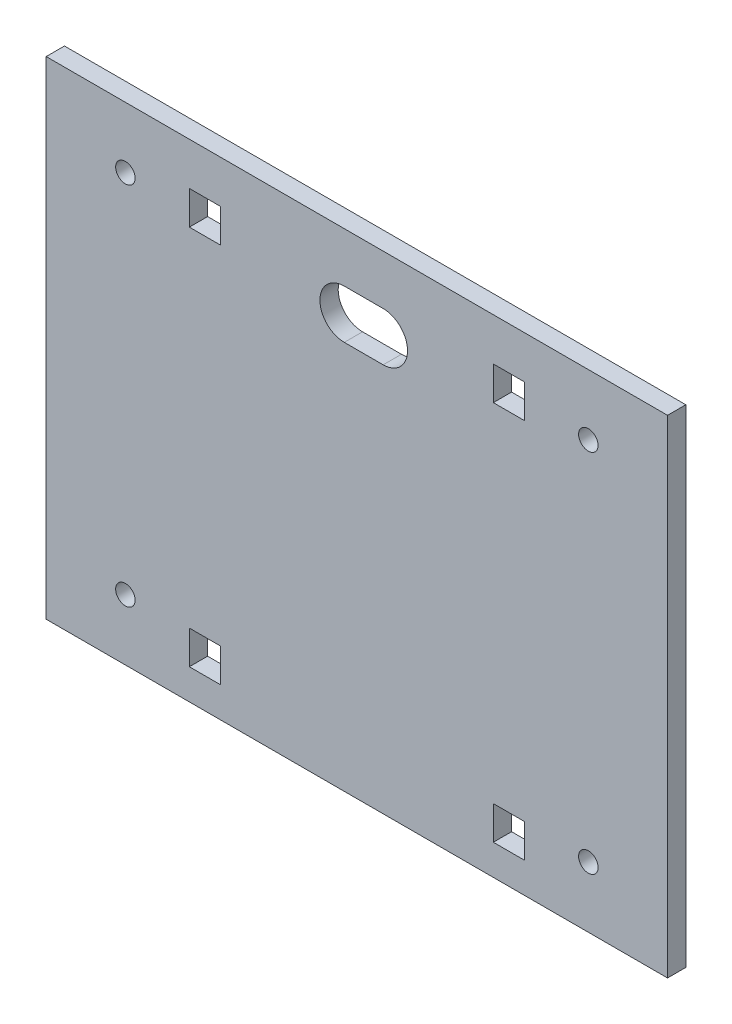
ISO-10303-21;
HEADER;
FILE_DESCRIPTION(('STEP AP214'),'2;1');
FILE_NAME('part.step','',(''),(''),'','','');
FILE_SCHEMA(('AUTOMOTIVE_DESIGN { 1 0 10303 214 1 1 1 1 }'));
ENDSEC;
DATA;
#1=APPLICATION_CONTEXT('core data for automotive mechanical design processes');
#2=APPLICATION_PROTOCOL_DEFINITION('international standard','automotive_design',2000,#1);
#3=PRODUCT_CONTEXT('',#1,'mechanical');
#4=PRODUCT('Part','Part','',(#3));
#5=PRODUCT_RELATED_PRODUCT_CATEGORY('part','',(#4));
#6=PRODUCT_DEFINITION_FORMATION('','',#4);
#7=PRODUCT_DEFINITION_CONTEXT('part definition',#1,'design');
#8=PRODUCT_DEFINITION('design','',#6,#7);
#9=PRODUCT_DEFINITION_SHAPE('','',#8);
#10=(LENGTH_UNIT() NAMED_UNIT(*) SI_UNIT(.MILLI.,.METRE.));
#11=(NAMED_UNIT(*) PLANE_ANGLE_UNIT() SI_UNIT($,.RADIAN.));
#12=(NAMED_UNIT(*) SI_UNIT($,.STERADIAN.) SOLID_ANGLE_UNIT());
#13=UNCERTAINTY_MEASURE_WITH_UNIT(LENGTH_MEASURE(1.E-05),#10,'distance_accuracy_value','');
#14=(GEOMETRIC_REPRESENTATION_CONTEXT(3) GLOBAL_UNCERTAINTY_ASSIGNED_CONTEXT((#13)) GLOBAL_UNIT_ASSIGNED_CONTEXT((#10,
#11,#12)) REPRESENTATION_CONTEXT('',''));
#15=CARTESIAN_POINT('',(0.,0.,0.));
#16=DIRECTION('',(0.,0.,1.));
#17=DIRECTION('',(1.,0.,0.));
#18=AXIS2_PLACEMENT_3D('',#15,#16,#17);
#19=CARTESIAN_POINT('',(0.,0.,3.));
#20=DIRECTION('',(0.,0.,-1.));
#21=DIRECTION('',(-1.,0.,0.));
#22=AXIS2_PLACEMENT_3D('',#19,#20,#21);
#23=PLANE('',#22);
#24=DIRECTION('',(0.,-1.,0.));
#25=VECTOR('',#24,1.);
#26=CARTESIAN_POINT('',(27.500000000002,-94.7499999999985,3.));
#27=LINE('',#26,#25);
#28=CARTESIAN_POINT('',(27.500000000002,-94.7499999999985,3.));
#29=VERTEX_POINT('',#28);
#30=CARTESIAN_POINT('',(27.500000000002,-100.249999999999,3.));
#31=VERTEX_POINT('',#30);
#32=EDGE_CURVE('E236',#29,#31,#27,.T.);
#33=ORIENTED_EDGE('',*,*,#32,.T.);
#34=DIRECTION('',(-1.,0.,0.));
#35=VECTOR('',#34,1.);
#36=CARTESIAN_POINT('',(27.500000000002,-100.249999999999,3.));
#37=LINE('',#36,#35);
#38=CARTESIAN_POINT('',(22.400000000002,-100.249999999999,3.));
#39=VERTEX_POINT('',#38);
#40=EDGE_CURVE('E251',#31,#39,#37,.T.);
#41=ORIENTED_EDGE('',*,*,#40,.T.);
#42=DIRECTION('',(0.,1.,0.));
#43=VECTOR('',#42,1.);
#44=CARTESIAN_POINT('',(22.400000000002,-94.7499999999985,3.));
#45=LINE('',#44,#43);
#46=CARTESIAN_POINT('',(22.400000000002,-94.7499999999985,3.));
#47=VERTEX_POINT('',#46);
#48=EDGE_CURVE('E248',#39,#47,#45,.T.);
#49=ORIENTED_EDGE('',*,*,#48,.T.);
#50=DIRECTION('',(1.,0.,0.));
#51=VECTOR('',#50,1.);
#52=CARTESIAN_POINT('',(27.500000000002,-94.7499999999985,3.));
#53=LINE('',#52,#51);
#54=EDGE_CURVE('E245',#47,#29,#53,.T.);
#55=ORIENTED_EDGE('',*,*,#54,.T.);
#56=EDGE_LOOP('',(#33,#41,#49,#55));
#57=FACE_BOUND('',#56,.T.);
#58=DIRECTION('',(1.,0.,0.));
#59=VECTOR('',#58,1.);
#60=CARTESIAN_POINT('',(-27.500000000002,-100.249999999999,3.));
#61=LINE('',#60,#59);
#62=CARTESIAN_POINT('',(-27.500000000002,-100.249999999999,3.));
#63=VERTEX_POINT('',#62);
#64=CARTESIAN_POINT('',(-22.400000000002,-100.249999999999,3.));
#65=VERTEX_POINT('',#64);
#66=EDGE_CURVE('E265',#63,#65,#61,.T.);
#67=ORIENTED_EDGE('',*,*,#66,.F.);
#68=DIRECTION('',(0.,-1.,0.));
#69=VECTOR('',#68,1.);
#70=CARTESIAN_POINT('',(-27.500000000002,-94.7499999999985,3.));
#71=LINE('',#70,#69);
#72=CARTESIAN_POINT('',(-27.500000000002,-94.7499999999985,3.));
#73=VERTEX_POINT('',#72);
#74=EDGE_CURVE('E257',#73,#63,#71,.T.);
#75=ORIENTED_EDGE('',*,*,#74,.F.);
#76=DIRECTION('',(-1.,0.,0.));
#77=VECTOR('',#76,1.);
#78=CARTESIAN_POINT('',(-27.500000000002,-94.7499999999985,3.));
#79=LINE('',#78,#77);
#80=CARTESIAN_POINT('',(-22.400000000002,-94.7499999999985,3.));
#81=VERTEX_POINT('',#80);
#82=EDGE_CURVE('E271',#81,#73,#79,.T.);
#83=ORIENTED_EDGE('',*,*,#82,.F.);
#84=DIRECTION('',(0.,1.,0.));
#85=VECTOR('',#84,1.);
#86=CARTESIAN_POINT('',(-22.400000000002,-94.7499999999985,3.));
#87=LINE('',#86,#85);
#88=EDGE_CURVE('E268',#65,#81,#87,.T.);
#89=ORIENTED_EDGE('',*,*,#88,.F.);
#90=EDGE_LOOP('',(#67,#75,#83,#89));
#91=FACE_BOUND('',#90,.T.);
#92=DIRECTION('',(1.,0.,0.));
#93=VECTOR('',#92,1.);
#94=CARTESIAN_POINT('',(-2.06554207472256,-41.4151948880287,3.));
#95=LINE('',#94,#93);
#96=CARTESIAN_POINT('',(-2.06554207472256,-41.4151948880287,3.));
#97=VERTEX_POINT('',#96);
#98=CARTESIAN_POINT('',(4.31837847580327,-41.4151948880287,3.));
#99=VERTEX_POINT('',#98);
#100=EDGE_CURVE('E299',#97,#99,#95,.T.);
#101=ORIENTED_EDGE('',*,*,#100,.F.);
#102=CARTESIAN_POINT('',(-2.06554207472263,-37.4151948880287,3.));
#103=DIRECTION('',(0.,0.,1.));
#104=DIRECTION('',(1.,0.,0.));
#105=AXIS2_PLACEMENT_3D('',#102,#103,#104);
#106=CIRCLE('',#105,4.);
#107=CARTESIAN_POINT('',(-2.06554207472256,-33.4151948880287,3.));
#108=VERTEX_POINT('',#107);
#109=EDGE_CURVE('E277',#108,#97,#106,.T.);
#110=ORIENTED_EDGE('',*,*,#109,.F.);
#111=DIRECTION('',(-1.,0.,0.));
#112=VECTOR('',#111,1.);
#113=CARTESIAN_POINT('',(-2.06554207472256,-33.4151948880287,3.));
#114=LINE('',#113,#112);
#115=CARTESIAN_POINT('',(4.31837847580327,-33.4151948880287,3.));
#116=VERTEX_POINT('',#115);
#117=EDGE_CURVE('E288',#116,#108,#114,.T.);
#118=ORIENTED_EDGE('',*,*,#117,.F.);
#119=CARTESIAN_POINT('',(4.3183784758032,-37.4151948880287,3.));
#120=DIRECTION('',(0.,0.,1.));
#121=DIRECTION('',(1.,0.,0.));
#122=AXIS2_PLACEMENT_3D('',#119,#120,#121);
#123=CIRCLE('',#122,4.);
#124=EDGE_CURVE('E302',#99,#116,#123,.T.);
#125=ORIENTED_EDGE('',*,*,#124,.F.);
#126=EDGE_LOOP('',(#101,#110,#118,#125));
#127=FACE_BOUND('',#126,.T.);
#128=DIRECTION('',(0.,1.,0.));
#129=VECTOR('',#128,1.);
#130=CARTESIAN_POINT('',(50.9999999999784,-25.25,3.));
#131=LINE('',#130,#129);
#132=CARTESIAN_POINT('',(50.9999999999784,-105.25,3.));
#133=VERTEX_POINT('',#132);
#134=CARTESIAN_POINT('',(50.9999999999784,-25.25,3.));
#135=VERTEX_POINT('',#134);
#136=EDGE_CURVE('E340',#133,#135,#131,.T.);
#137=ORIENTED_EDGE('',*,*,#136,.T.);
#138=DIRECTION('',(-1.,0.,0.));
#139=VECTOR('',#138,1.);
#140=CARTESIAN_POINT('',(50.9999999999784,-25.25,3.));
#141=LINE('',#140,#139);
#142=CARTESIAN_POINT('',(-51.0000000000086,-25.25,3.));
#143=VERTEX_POINT('',#142);
#144=EDGE_CURVE('E343',#135,#143,#141,.T.);
#145=ORIENTED_EDGE('',*,*,#144,.T.);
#146=DIRECTION('',(0.,-1.,0.));
#147=VECTOR('',#146,1.);
#148=CARTESIAN_POINT('',(-51.0000000000086,-25.25,3.));
#149=LINE('',#148,#147);
#150=CARTESIAN_POINT('',(-51.0000000000086,-105.25,3.));
#151=VERTEX_POINT('',#150);
#152=EDGE_CURVE('E346',#143,#151,#149,.T.);
#153=ORIENTED_EDGE('',*,*,#152,.T.);
#154=DIRECTION('',(1.,0.,0.));
#155=VECTOR('',#154,1.);
#156=CARTESIAN_POINT('',(50.9999999999784,-105.25,3.));
#157=LINE('',#156,#155);
#158=EDGE_CURVE('E348',#151,#133,#157,.T.);
#159=ORIENTED_EDGE('',*,*,#158,.T.);
#160=EDGE_LOOP('',(#137,#145,#153,#159));
#161=FACE_BOUND('',#160,.T.);
#162=CARTESIAN_POINT('',(-38.0000000000219,-35.25,3.));
#163=DIRECTION('',(0.,0.,1.));
#164=DIRECTION('',(1.,0.,0.));
#165=AXIS2_PLACEMENT_3D('',#162,#163,#164);
#166=CIRCLE('',#165,1.6);
#167=CARTESIAN_POINT('',(-36.4000000000219,-35.25,3.));
#168=VERTEX_POINT('',#167);
#169=EDGE_CURVE('E334',#168,#168,#166,.T.);
#170=ORIENTED_EDGE('',*,*,#169,.F.);
#171=EDGE_LOOP('',(#170));
#172=FACE_BOUND('',#171,.T.);
#173=CARTESIAN_POINT('',(-38.0000000000219,-95.25,3.));
#174=DIRECTION('',(0.,0.,1.));
#175=DIRECTION('',(1.,0.,0.));
#176=AXIS2_PLACEMENT_3D('',#173,#174,#175);
#177=CIRCLE('',#176,1.59999999999999);
#178=CARTESIAN_POINT('',(-36.4000000000219,-95.25,3.));
#179=VERTEX_POINT('',#178);
#180=EDGE_CURVE('E328',#179,#179,#177,.T.);
#181=ORIENTED_EDGE('',*,*,#180,.F.);
#182=EDGE_LOOP('',(#181));
#183=FACE_BOUND('',#182,.T.);
#184=CARTESIAN_POINT('',(37.9999999999954,-95.25,3.));
#185=DIRECTION('',(0.,0.,1.));
#186=DIRECTION('',(1.,0.,0.));
#187=AXIS2_PLACEMENT_3D('',#184,#185,#186);
#188=CIRCLE('',#187,1.6);
#189=CARTESIAN_POINT('',(39.5999999999954,-95.25,3.));
#190=VERTEX_POINT('',#189);
#191=EDGE_CURVE('E322',#190,#190,#188,.T.);
#192=ORIENTED_EDGE('',*,*,#191,.F.);
#193=EDGE_LOOP('',(#192));
#194=FACE_BOUND('',#193,.T.);
#195=CARTESIAN_POINT('',(37.9999999999949,-35.25,3.));
#196=DIRECTION('',(0.,0.,1.));
#197=DIRECTION('',(1.,0.,0.));
#198=AXIS2_PLACEMENT_3D('',#195,#196,#197);
#199=CIRCLE('',#198,1.60000000000055);
#200=CARTESIAN_POINT('',(39.5999999999954,-35.25,3.));
#201=VERTEX_POINT('',#200);
#202=EDGE_CURVE('E316',#201,#201,#199,.T.);
#203=ORIENTED_EDGE('',*,*,#202,.F.);
#204=EDGE_LOOP('',(#203));
#205=FACE_BOUND('',#204,.T.);
#206=DIRECTION('',(1.,0.,0.));
#207=VECTOR('',#206,1.);
#208=CARTESIAN_POINT('',(-27.500000000002,-37.7499999999985,3.));
#209=LINE('',#208,#207);
#210=CARTESIAN_POINT('',(-27.500000000002,-37.7499999999985,3.));
#211=VERTEX_POINT('',#210);
#212=CARTESIAN_POINT('',(-22.400000000002,-37.7499999999985,3.));
#213=VERTEX_POINT('',#212);
#214=EDGE_CURVE('E224',#211,#213,#209,.T.);
#215=ORIENTED_EDGE('',*,*,#214,.F.);
#216=DIRECTION('',(0.,-1.,0.));
#217=VECTOR('',#216,1.);
#218=CARTESIAN_POINT('',(-27.500000000002,-32.2499999999985,3.));
#219=LINE('',#218,#217);
#220=CARTESIAN_POINT('',(-27.500000000002,-32.2499999999985,3.));
#221=VERTEX_POINT('',#220);
#222=EDGE_CURVE('E220',#221,#211,#219,.T.);
#223=ORIENTED_EDGE('',*,*,#222,.F.);
#224=DIRECTION('',(-1.,0.,0.));
#225=VECTOR('',#224,1.);
#226=CARTESIAN_POINT('',(-27.500000000002,-32.2499999999985,3.));
#227=LINE('',#226,#225);
#228=CARTESIAN_POINT('',(-22.400000000002,-32.2499999999985,3.));
#229=VERTEX_POINT('',#228);
#230=EDGE_CURVE('E230',#229,#221,#227,.T.);
#231=ORIENTED_EDGE('',*,*,#230,.F.);
#232=DIRECTION('',(0.,1.,0.));
#233=VECTOR('',#232,1.);
#234=CARTESIAN_POINT('',(-22.400000000002,-32.2499999999985,3.));
#235=LINE('',#234,#233);
#236=EDGE_CURVE('E227',#213,#229,#235,.T.);
#237=ORIENTED_EDGE('',*,*,#236,.F.);
#238=EDGE_LOOP('',(#215,#223,#231,#237));
#239=FACE_BOUND('',#238,.T.);
#240=DIRECTION('',(0.,-1.,0.));
#241=VECTOR('',#240,1.);
#242=CARTESIAN_POINT('',(27.500000000002,-32.2499999999985,3.));
#243=LINE('',#242,#241);
#244=CARTESIAN_POINT('',(27.500000000002,-32.2499999999985,3.));
#245=VERTEX_POINT('',#244);
#246=CARTESIAN_POINT('',(27.500000000002,-37.7499999999985,3.));
#247=VERTEX_POINT('',#246);
#248=EDGE_CURVE('E50',#245,#247,#243,.T.);
#249=ORIENTED_EDGE('',*,*,#248,.T.);
#250=DIRECTION('',(-1.,0.,0.));
#251=VECTOR('',#250,1.);
#252=CARTESIAN_POINT('',(27.500000000002,-37.7499999999985,3.));
#253=LINE('',#252,#251);
#254=CARTESIAN_POINT('',(22.400000000002,-37.7499999999985,3.));
#255=VERTEX_POINT('',#254);
#256=EDGE_CURVE('E213',#247,#255,#253,.T.);
#257=ORIENTED_EDGE('',*,*,#256,.T.);
#258=DIRECTION('',(0.,1.,0.));
#259=VECTOR('',#258,1.);
#260=CARTESIAN_POINT('',(22.400000000002,-32.2499999999985,3.));
#261=LINE('',#260,#259);
#262=CARTESIAN_POINT('',(22.400000000002,-32.2499999999985,3.));
#263=VERTEX_POINT('',#262);
#264=EDGE_CURVE('E199',#255,#263,#261,.T.);
#265=ORIENTED_EDGE('',*,*,#264,.T.);
#266=DIRECTION('',(1.,0.,0.));
#267=VECTOR('',#266,1.);
#268=CARTESIAN_POINT('',(27.500000000002,-32.2499999999985,3.));
#269=LINE('',#268,#267);
#270=EDGE_CURVE('E208',#263,#245,#269,.T.);
#271=ORIENTED_EDGE('',*,*,#270,.T.);
#272=EDGE_LOOP('',(#249,#257,#265,#271));
#273=FACE_BOUND('',#272,.T.);
#274=ADVANCED_FACE('F35',(#57,#91,#127,#161,#172,#183,#194,#205,#239,#273),#23,.F.);
#275=CARTESIAN_POINT('',(0.,0.,0.));
#276=DIRECTION('',(0.,0.,-1.));
#277=DIRECTION('',(-1.,0.,0.));
#278=AXIS2_PLACEMENT_3D('',#275,#276,#277);
#279=PLANE('',#278);
#280=DIRECTION('',(0.,1.,0.));
#281=VECTOR('',#280,1.);
#282=CARTESIAN_POINT('',(-27.500000000002,0.,0.));
#283=LINE('',#282,#281);
#284=CARTESIAN_POINT('',(-27.500000000002,-37.7499999999985,0.));
#285=VERTEX_POINT('',#284);
#286=CARTESIAN_POINT('',(-27.500000000002,-32.2499999999985,0.));
#287=VERTEX_POINT('',#286);
#288=EDGE_CURVE('E397',#285,#287,#283,.T.);
#289=ORIENTED_EDGE('',*,*,#288,.F.);
#290=DIRECTION('',(-1.,0.,0.));
#291=VECTOR('',#290,1.);
#292=CARTESIAN_POINT('',(0.,-37.7499999999985,0.));
#293=LINE('',#292,#291);
#294=CARTESIAN_POINT('',(-22.400000000002,-37.7499999999985,0.));
#295=VERTEX_POINT('',#294);
#296=EDGE_CURVE('E390',#295,#285,#293,.T.);
#297=ORIENTED_EDGE('',*,*,#296,.F.);
#298=DIRECTION('',(0.,-1.,0.));
#299=VECTOR('',#298,1.);
#300=CARTESIAN_POINT('',(-22.400000000002,0.,0.));
#301=LINE('',#300,#299);
#302=CARTESIAN_POINT('',(-22.400000000002,-32.2499999999985,0.));
#303=VERTEX_POINT('',#302);
#304=EDGE_CURVE('E392',#303,#295,#301,.T.);
#305=ORIENTED_EDGE('',*,*,#304,.F.);
#306=DIRECTION('',(1.,0.,0.));
#307=VECTOR('',#306,1.);
#308=CARTESIAN_POINT('',(0.,-32.2499999999985,0.));
#309=LINE('',#308,#307);
#310=EDGE_CURVE('E395',#287,#303,#309,.T.);
#311=ORIENTED_EDGE('',*,*,#310,.F.);
#312=EDGE_LOOP('',(#289,#297,#305,#311));
#313=FACE_BOUND('',#312,.T.);
#314=DIRECTION('',(0.,1.,0.));
#315=VECTOR('',#314,1.);
#316=CARTESIAN_POINT('',(-27.500000000002,0.,0.));
#317=LINE('',#316,#315);
#318=CARTESIAN_POINT('',(-27.500000000002,-100.249999999999,0.));
#319=VERTEX_POINT('',#318);
#320=CARTESIAN_POINT('',(-27.500000000002,-94.7499999999985,0.));
#321=VERTEX_POINT('',#320);
#322=EDGE_CURVE('E376',#319,#321,#317,.T.);
#323=ORIENTED_EDGE('',*,*,#322,.F.);
#324=DIRECTION('',(-1.,0.,0.));
#325=VECTOR('',#324,1.);
#326=CARTESIAN_POINT('',(0.,-100.249999999999,0.));
#327=LINE('',#326,#325);
#328=CARTESIAN_POINT('',(-22.400000000002,-100.249999999999,0.));
#329=VERTEX_POINT('',#328);
#330=EDGE_CURVE('E369',#329,#319,#327,.T.);
#331=ORIENTED_EDGE('',*,*,#330,.F.);
#332=DIRECTION('',(0.,-1.,0.));
#333=VECTOR('',#332,1.);
#334=CARTESIAN_POINT('',(-22.4000000000021,0.,0.));
#335=LINE('',#334,#333);
#336=CARTESIAN_POINT('',(-22.400000000002,-94.7499999999985,0.));
#337=VERTEX_POINT('',#336);
#338=EDGE_CURVE('E371',#337,#329,#335,.T.);
#339=ORIENTED_EDGE('',*,*,#338,.F.);
#340=DIRECTION('',(1.,0.,0.));
#341=VECTOR('',#340,1.);
#342=CARTESIAN_POINT('',(0.,-94.7499999999985,0.));
#343=LINE('',#342,#341);
#344=EDGE_CURVE('E374',#321,#337,#343,.T.);
#345=ORIENTED_EDGE('',*,*,#344,.F.);
#346=EDGE_LOOP('',(#323,#331,#339,#345));
#347=FACE_BOUND('',#346,.T.);
#348=CARTESIAN_POINT('',(-2.06554207472263,-37.4151948880287,0.));
#349=DIRECTION('',(0.,0.,1.));
#350=DIRECTION('',(1.,0.,0.));
#351=AXIS2_PLACEMENT_3D('',#348,#349,#350);
#352=CIRCLE('',#351,4.);
#353=CARTESIAN_POINT('',(-2.06554207472256,-33.4151948880287,0.));
#354=VERTEX_POINT('',#353);
#355=CARTESIAN_POINT('',(-2.06554207472256,-41.4151948880287,0.));
#356=VERTEX_POINT('',#355);
#357=EDGE_CURVE('E284',#354,#356,#352,.T.);
#358=ORIENTED_EDGE('',*,*,#357,.T.);
#359=DIRECTION('',(1.,0.,0.));
#360=VECTOR('',#359,1.);
#361=CARTESIAN_POINT('',(-2.06554207472256,-41.4151948880287,0.));
#362=LINE('',#361,#360);
#363=CARTESIAN_POINT('',(4.31837847580327,-41.4151948880287,0.));
#364=VERTEX_POINT('',#363);
#365=EDGE_CURVE('E287',#356,#364,#362,.T.);
#366=ORIENTED_EDGE('',*,*,#365,.T.);
#367=CARTESIAN_POINT('',(4.3183784758032,-37.4151948880287,0.));
#368=DIRECTION('',(0.,0.,1.));
#369=DIRECTION('',(1.,0.,0.));
#370=AXIS2_PLACEMENT_3D('',#367,#368,#369);
#371=CIRCLE('',#370,4.);
#372=CARTESIAN_POINT('',(4.31837847580327,-33.4151948880287,0.));
#373=VERTEX_POINT('',#372);
#374=EDGE_CURVE('E291',#364,#373,#371,.T.);
#375=ORIENTED_EDGE('',*,*,#374,.T.);
#376=DIRECTION('',(-1.,0.,0.));
#377=VECTOR('',#376,1.);
#378=CARTESIAN_POINT('',(-2.06554207472256,-33.4151948880287,0.));
#379=LINE('',#378,#377);
#380=EDGE_CURVE('E294',#373,#354,#379,.T.);
#381=ORIENTED_EDGE('',*,*,#380,.T.);
#382=EDGE_LOOP('',(#358,#366,#375,#381));
#383=FACE_BOUND('',#382,.T.);
#384=CARTESIAN_POINT('',(37.9999999999954,-95.25,0.));
#385=DIRECTION('',(0.,0.,1.));
#386=DIRECTION('',(1.,0.,0.));
#387=AXIS2_PLACEMENT_3D('',#384,#385,#386);
#388=CIRCLE('',#387,1.6);
#389=CARTESIAN_POINT('',(39.5999999999954,-95.25,0.));
#390=VERTEX_POINT('',#389);
#391=EDGE_CURVE('E319',#390,#390,#388,.T.);
#392=ORIENTED_EDGE('',*,*,#391,.T.);
#393=EDGE_LOOP('',(#392));
#394=FACE_BOUND('',#393,.T.);
#395=CARTESIAN_POINT('',(-38.0000000000219,-35.25,0.));
#396=DIRECTION('',(0.,0.,1.));
#397=DIRECTION('',(1.,0.,0.));
#398=AXIS2_PLACEMENT_3D('',#395,#396,#397);
#399=CIRCLE('',#398,1.6);
#400=CARTESIAN_POINT('',(-36.4000000000219,-35.25,0.));
#401=VERTEX_POINT('',#400);
#402=EDGE_CURVE('E331',#401,#401,#399,.T.);
#403=ORIENTED_EDGE('',*,*,#402,.T.);
#404=EDGE_LOOP('',(#403));
#405=FACE_BOUND('',#404,.T.);
#406=DIRECTION('',(0.,1.,0.));
#407=VECTOR('',#406,1.);
#408=CARTESIAN_POINT('',(50.9999999999784,-25.25,0.));
#409=LINE('',#408,#407);
#410=CARTESIAN_POINT('',(50.9999999999784,-105.25,0.));
#411=VERTEX_POINT('',#410);
#412=CARTESIAN_POINT('',(50.9999999999784,-25.25,0.));
#413=VERTEX_POINT('',#412);
#414=EDGE_CURVE('E337',#411,#413,#409,.T.);
#415=ORIENTED_EDGE('',*,*,#414,.F.);
#416=DIRECTION('',(1.,0.,0.));
#417=VECTOR('',#416,1.);
#418=CARTESIAN_POINT('',(50.9999999999784,-105.25,0.));
#419=LINE('',#418,#417);
#420=CARTESIAN_POINT('',(-51.0000000000086,-105.25,0.));
#421=VERTEX_POINT('',#420);
#422=EDGE_CURVE('E344',#421,#411,#419,.T.);
#423=ORIENTED_EDGE('',*,*,#422,.F.);
#424=DIRECTION('',(0.,-1.,0.));
#425=VECTOR('',#424,1.);
#426=CARTESIAN_POINT('',(-51.0000000000086,-25.25,0.));
#427=LINE('',#426,#425);
#428=CARTESIAN_POINT('',(-51.0000000000086,-25.25,0.));
#429=VERTEX_POINT('',#428);
#430=EDGE_CURVE('E355',#429,#421,#427,.T.);
#431=ORIENTED_EDGE('',*,*,#430,.F.);
#432=DIRECTION('',(-1.,0.,0.));
#433=VECTOR('',#432,1.);
#434=CARTESIAN_POINT('',(50.9999999999784,-25.25,0.));
#435=LINE('',#434,#433);
#436=EDGE_CURVE('E353',#413,#429,#435,.T.);
#437=ORIENTED_EDGE('',*,*,#436,.F.);
#438=EDGE_LOOP('',(#415,#423,#431,#437));
#439=FACE_BOUND('',#438,.T.);
#440=CARTESIAN_POINT('',(-38.0000000000219,-95.25,0.));
#441=DIRECTION('',(0.,0.,1.));
#442=DIRECTION('',(1.,0.,0.));
#443=AXIS2_PLACEMENT_3D('',#440,#441,#442);
#444=CIRCLE('',#443,1.59999999999999);
#445=CARTESIAN_POINT('',(-36.4000000000219,-95.25,0.));
#446=VERTEX_POINT('',#445);
#447=EDGE_CURVE('E325',#446,#446,#444,.T.);
#448=ORIENTED_EDGE('',*,*,#447,.T.);
#449=EDGE_LOOP('',(#448));
#450=FACE_BOUND('',#449,.T.);
#451=CARTESIAN_POINT('',(37.9999999999949,-35.25,0.));
#452=DIRECTION('',(0.,0.,1.));
#453=DIRECTION('',(1.,0.,0.));
#454=AXIS2_PLACEMENT_3D('',#451,#452,#453);
#455=CIRCLE('',#454,1.60000000000055);
#456=CARTESIAN_POINT('',(39.5999999999954,-35.25,0.));
#457=VERTEX_POINT('',#456);
#458=EDGE_CURVE('E309',#457,#457,#455,.T.);
#459=ORIENTED_EDGE('',*,*,#458,.T.);
#460=EDGE_LOOP('',(#459));
#461=FACE_BOUND('',#460,.T.);
#462=DIRECTION('',(1.,0.,0.));
#463=VECTOR('',#462,1.);
#464=CARTESIAN_POINT('',(0.,-100.249999999999,0.));
#465=LINE('',#464,#463);
#466=CARTESIAN_POINT('',(22.400000000002,-100.249999999999,0.));
#467=VERTEX_POINT('',#466);
#468=CARTESIAN_POINT('',(27.500000000002,-100.249999999999,0.));
#469=VERTEX_POINT('',#468);
#470=EDGE_CURVE('E384',#467,#469,#465,.T.);
#471=ORIENTED_EDGE('',*,*,#470,.T.);
#472=DIRECTION('',(0.,1.,0.));
#473=VECTOR('',#472,1.);
#474=CARTESIAN_POINT('',(27.500000000002,0.,0.));
#475=LINE('',#474,#473);
#476=CARTESIAN_POINT('',(27.500000000002,-94.7499999999985,0.));
#477=VERTEX_POINT('',#476);
#478=EDGE_CURVE('E387',#469,#477,#475,.T.);
#479=ORIENTED_EDGE('',*,*,#478,.T.);
#480=DIRECTION('',(-1.,0.,0.));
#481=VECTOR('',#480,1.);
#482=CARTESIAN_POINT('',(0.,-94.7499999999985,0.));
#483=LINE('',#482,#481);
#484=CARTESIAN_POINT('',(22.400000000002,-94.7499999999985,0.));
#485=VERTEX_POINT('',#484);
#486=EDGE_CURVE('E378',#477,#485,#483,.T.);
#487=ORIENTED_EDGE('',*,*,#486,.T.);
#488=DIRECTION('',(0.,-1.,0.));
#489=VECTOR('',#488,1.);
#490=CARTESIAN_POINT('',(22.4000000000021,0.,0.));
#491=LINE('',#490,#489);
#492=EDGE_CURVE('E381',#485,#467,#491,.T.);
#493=ORIENTED_EDGE('',*,*,#492,.T.);
#494=EDGE_LOOP('',(#471,#479,#487,#493));
#495=FACE_BOUND('',#494,.T.);
#496=DIRECTION('',(1.,0.,0.));
#497=VECTOR('',#496,1.);
#498=CARTESIAN_POINT('',(0.,-37.7499999999985,0.));
#499=LINE('',#498,#497);
#500=CARTESIAN_POINT('',(22.400000000002,-37.7499999999985,0.));
#501=VERTEX_POINT('',#500);
#502=CARTESIAN_POINT('',(27.500000000002,-37.7499999999985,0.));
#503=VERTEX_POINT('',#502);
#504=EDGE_CURVE('E43',#501,#503,#499,.T.);
#505=ORIENTED_EDGE('',*,*,#504,.T.);
#506=DIRECTION('',(0.,1.,0.));
#507=VECTOR('',#506,1.);
#508=CARTESIAN_POINT('',(27.500000000002,0.,0.));
#509=LINE('',#508,#507);
#510=CARTESIAN_POINT('',(27.500000000002,-32.2499999999985,0.));
#511=VERTEX_POINT('',#510);
#512=EDGE_CURVE('E11',#503,#511,#509,.T.);
#513=ORIENTED_EDGE('',*,*,#512,.T.);
#514=DIRECTION('',(-1.,0.,0.));
#515=VECTOR('',#514,1.);
#516=CARTESIAN_POINT('',(0.,-32.2499999999985,0.));
#517=LINE('',#516,#515);
#518=CARTESIAN_POINT('',(22.400000000002,-32.2499999999985,0.));
#519=VERTEX_POINT('',#518);
#520=EDGE_CURVE('E399',#511,#519,#517,.T.);
#521=ORIENTED_EDGE('',*,*,#520,.T.);
#522=DIRECTION('',(0.,-1.,0.));
#523=VECTOR('',#522,1.);
#524=CARTESIAN_POINT('',(22.400000000002,0.,0.));
#525=LINE('',#524,#523);
#526=EDGE_CURVE('E202',#519,#501,#525,.T.);
#527=ORIENTED_EDGE('',*,*,#526,.T.);
#528=EDGE_LOOP('',(#505,#513,#521,#527));
#529=FACE_BOUND('',#528,.T.);
#530=ADVANCED_FACE('F403',(#313,#347,#383,#394,#405,#439,#450,#461,#495,#529),#279,.T.);
#531=CARTESIAN_POINT('',(50.9999999999784,-25.25,3.));
#532=DIRECTION('',(-1.,0.,0.));
#533=DIRECTION('',(0.,0.,1.));
#534=AXIS2_PLACEMENT_3D('',#531,#532,#533);
#535=PLANE('',#534);
#536=ORIENTED_EDGE('',*,*,#414,.T.);
#537=DIRECTION('',(0.,0.,-1.));
#538=VECTOR('',#537,1.);
#539=CARTESIAN_POINT('',(50.9999999999784,-25.25,3.));
#540=LINE('',#539,#538);
#541=EDGE_CURVE('E366',#135,#413,#540,.T.);
#542=ORIENTED_EDGE('',*,*,#541,.F.);
#543=ORIENTED_EDGE('',*,*,#136,.F.);
#544=DIRECTION('',(0.,0.,-1.));
#545=VECTOR('',#544,1.);
#546=CARTESIAN_POINT('',(50.9999999999784,-105.25,3.));
#547=LINE('',#546,#545);
#548=EDGE_CURVE('E350',#133,#411,#547,.T.);
#549=ORIENTED_EDGE('',*,*,#548,.T.);
#550=EDGE_LOOP('',(#536,#542,#543,#549));
#551=FACE_BOUND('',#550,.T.);
#552=ADVANCED_FACE('F37',(#551),#535,.F.);
#553=CARTESIAN_POINT('',(50.9999999999784,-25.25,3.));
#554=DIRECTION('',(0.,-1.,0.));
#555=DIRECTION('',(0.,0.,-1.));
#556=AXIS2_PLACEMENT_3D('',#553,#554,#555);
#557=PLANE('',#556);
#558=ORIENTED_EDGE('',*,*,#436,.T.);
#559=DIRECTION('',(0.,0.,-1.));
#560=VECTOR('',#559,1.);
#561=CARTESIAN_POINT('',(-51.0000000000086,-25.25,3.));
#562=LINE('',#561,#560);
#563=EDGE_CURVE('E363',#143,#429,#562,.T.);
#564=ORIENTED_EDGE('',*,*,#563,.F.);
#565=ORIENTED_EDGE('',*,*,#144,.F.);
#566=ORIENTED_EDGE('',*,*,#541,.T.);
#567=EDGE_LOOP('',(#558,#564,#565,#566));
#568=FACE_BOUND('',#567,.T.);
#569=ADVANCED_FACE('F441',(#568),#557,.F.);
#570=CARTESIAN_POINT('',(-51.0000000000086,-25.25,3.));
#571=DIRECTION('',(1.,0.,0.));
#572=DIRECTION('',(0.,0.,-1.));
#573=AXIS2_PLACEMENT_3D('',#570,#571,#572);
#574=PLANE('',#573);
#575=ORIENTED_EDGE('',*,*,#430,.T.);
#576=DIRECTION('',(0.,0.,-1.));
#577=VECTOR('',#576,1.);
#578=CARTESIAN_POINT('',(-51.0000000000086,-105.25,3.));
#579=LINE('',#578,#577);
#580=EDGE_CURVE('E360',#151,#421,#579,.T.);
#581=ORIENTED_EDGE('',*,*,#580,.F.);
#582=ORIENTED_EDGE('',*,*,#152,.F.);
#583=ORIENTED_EDGE('',*,*,#563,.T.);
#584=EDGE_LOOP('',(#575,#581,#582,#583));
#585=FACE_BOUND('',#584,.T.);
#586=ADVANCED_FACE('F438',(#585),#574,.F.);
#587=CARTESIAN_POINT('',(50.9999999999784,-105.25,3.));
#588=DIRECTION('',(0.,1.,0.));
#589=DIRECTION('',(0.,0.,1.));
#590=AXIS2_PLACEMENT_3D('',#587,#588,#589);
#591=PLANE('',#590);
#592=ORIENTED_EDGE('',*,*,#422,.T.);
#593=ORIENTED_EDGE('',*,*,#548,.F.);
#594=ORIENTED_EDGE('',*,*,#158,.F.);
#595=ORIENTED_EDGE('',*,*,#580,.T.);
#596=EDGE_LOOP('',(#592,#593,#594,#595));
#597=FACE_BOUND('',#596,.T.);
#598=ADVANCED_FACE('F435',(#597),#591,.F.);
#599=CARTESIAN_POINT('',(-38.0000000000219,-35.25,3.));
#600=DIRECTION('',(0.,0.,-1.));
#601=DIRECTION('',(-1.,0.,0.));
#602=AXIS2_PLACEMENT_3D('',#599,#600,#601);
#603=CYLINDRICAL_SURFACE('',#602,1.6);
#604=ORIENTED_EDGE('',*,*,#169,.T.);
#605=EDGE_LOOP('',(#604));
#606=FACE_BOUND('',#605,.T.);
#607=ORIENTED_EDGE('',*,*,#402,.F.);
#608=EDGE_LOOP('',(#607));
#609=FACE_BOUND('',#608,.T.);
#610=ADVANCED_FACE('F432',(#606,#609),#603,.F.);
#611=CARTESIAN_POINT('',(-38.0000000000219,-95.25,3.));
#612=DIRECTION('',(0.,0.,-1.));
#613=DIRECTION('',(-1.,0.,0.));
#614=AXIS2_PLACEMENT_3D('',#611,#612,#613);
#615=CYLINDRICAL_SURFACE('',#614,1.59999999999999);
#616=ORIENTED_EDGE('',*,*,#180,.T.);
#617=EDGE_LOOP('',(#616));
#618=FACE_BOUND('',#617,.T.);
#619=ORIENTED_EDGE('',*,*,#447,.F.);
#620=EDGE_LOOP('',(#619));
#621=FACE_BOUND('',#620,.T.);
#622=ADVANCED_FACE('F550',(#618,#621),#615,.F.);
#623=CARTESIAN_POINT('',(37.9999999999954,-95.25,3.));
#624=DIRECTION('',(0.,0.,-1.));
#625=DIRECTION('',(-1.,0.,0.));
#626=AXIS2_PLACEMENT_3D('',#623,#624,#625);
#627=CYLINDRICAL_SURFACE('',#626,1.6);
#628=ORIENTED_EDGE('',*,*,#191,.T.);
#629=EDGE_LOOP('',(#628));
#630=FACE_BOUND('',#629,.T.);
#631=ORIENTED_EDGE('',*,*,#391,.F.);
#632=EDGE_LOOP('',(#631));
#633=FACE_BOUND('',#632,.T.);
#634=ADVANCED_FACE('F547',(#630,#633),#627,.F.);
#635=CARTESIAN_POINT('',(37.9999999999949,-35.25,3.));
#636=DIRECTION('',(0.,0.,-1.));
#637=DIRECTION('',(-1.,0.,0.));
#638=AXIS2_PLACEMENT_3D('',#635,#636,#637);
#639=CYLINDRICAL_SURFACE('',#638,1.60000000000055);
#640=ORIENTED_EDGE('',*,*,#202,.T.);
#641=EDGE_LOOP('',(#640));
#642=FACE_BOUND('',#641,.T.);
#643=ORIENTED_EDGE('',*,*,#458,.F.);
#644=EDGE_LOOP('',(#643));
#645=FACE_BOUND('',#644,.T.);
#646=ADVANCED_FACE('F543',(#642,#645),#639,.F.);
#647=CARTESIAN_POINT('',(-2.06554207472263,-37.4151948880287,0.));
#648=DIRECTION('',(0.,0.,1.));
#649=DIRECTION('',(1.,0.,0.));
#650=AXIS2_PLACEMENT_3D('',#647,#648,#649);
#651=CYLINDRICAL_SURFACE('',#650,4.);
#652=ORIENTED_EDGE('',*,*,#109,.T.);
#653=DIRECTION('',(0.,0.,1.));
#654=VECTOR('',#653,1.);
#655=CARTESIAN_POINT('',(-2.06554207472256,-41.4151948880287,0.));
#656=LINE('',#655,#654);
#657=EDGE_CURVE('E297',#356,#97,#656,.T.);
#658=ORIENTED_EDGE('',*,*,#657,.F.);
#659=ORIENTED_EDGE('',*,*,#357,.F.);
#660=DIRECTION('',(0.,0.,1.));
#661=VECTOR('',#660,1.);
#662=CARTESIAN_POINT('',(-2.06554207472256,-33.4151948880287,0.));
#663=LINE('',#662,#661);
#664=EDGE_CURVE('E307',#354,#108,#663,.T.);
#665=ORIENTED_EDGE('',*,*,#664,.T.);
#666=EDGE_LOOP('',(#652,#658,#659,#665));
#667=FACE_BOUND('',#666,.T.);
#668=ADVANCED_FACE('F533',(#667),#651,.F.);
#669=CARTESIAN_POINT('',(-2.06554207472256,-33.4151948880287,0.));
#670=DIRECTION('',(0.,1.,0.));
#671=DIRECTION('',(0.,0.,1.));
#672=AXIS2_PLACEMENT_3D('',#669,#670,#671);
#673=PLANE('',#672);
#674=ORIENTED_EDGE('',*,*,#117,.T.);
#675=ORIENTED_EDGE('',*,*,#664,.F.);
#676=ORIENTED_EDGE('',*,*,#380,.F.);
#677=DIRECTION('',(0.,0.,1.));
#678=VECTOR('',#677,1.);
#679=CARTESIAN_POINT('',(4.31837847580327,-33.4151948880287,0.));
#680=LINE('',#679,#678);
#681=EDGE_CURVE('E310',#373,#116,#680,.T.);
#682=ORIENTED_EDGE('',*,*,#681,.T.);
#683=EDGE_LOOP('',(#674,#675,#676,#682));
#684=FACE_BOUND('',#683,.T.);
#685=ADVANCED_FACE('F529',(#684),#673,.F.);
#686=CARTESIAN_POINT('',(4.3183784758032,-37.4151948880287,0.));
#687=DIRECTION('',(0.,0.,1.));
#688=DIRECTION('',(1.,0.,0.));
#689=AXIS2_PLACEMENT_3D('',#686,#687,#688);
#690=CYLINDRICAL_SURFACE('',#689,4.);
#691=ORIENTED_EDGE('',*,*,#124,.T.);
#692=ORIENTED_EDGE('',*,*,#681,.F.);
#693=ORIENTED_EDGE('',*,*,#374,.F.);
#694=DIRECTION('',(0.,0.,1.));
#695=VECTOR('',#694,1.);
#696=CARTESIAN_POINT('',(4.31837847580327,-41.4151948880287,0.));
#697=LINE('',#696,#695);
#698=EDGE_CURVE('E312',#364,#99,#697,.T.);
#699=ORIENTED_EDGE('',*,*,#698,.T.);
#700=EDGE_LOOP('',(#691,#692,#693,#699));
#701=FACE_BOUND('',#700,.T.);
#702=ADVANCED_FACE('F532',(#701),#690,.F.);
#703=CARTESIAN_POINT('',(-2.06554207472256,-41.4151948880287,0.));
#704=DIRECTION('',(0.,-1.,0.));
#705=DIRECTION('',(0.,0.,-1.));
#706=AXIS2_PLACEMENT_3D('',#703,#704,#705);
#707=PLANE('',#706);
#708=ORIENTED_EDGE('',*,*,#100,.T.);
#709=ORIENTED_EDGE('',*,*,#698,.F.);
#710=ORIENTED_EDGE('',*,*,#365,.F.);
#711=ORIENTED_EDGE('',*,*,#657,.T.);
#712=EDGE_LOOP('',(#708,#709,#710,#711));
#713=FACE_BOUND('',#712,.T.);
#714=ADVANCED_FACE('F527',(#713),#707,.F.);
#715=CARTESIAN_POINT('',(-27.500000000002,-94.7499999999985,-2.));
#716=DIRECTION('',(-1.,0.,0.));
#717=DIRECTION('',(0.,0.,1.));
#718=AXIS2_PLACEMENT_3D('',#715,#716,#717);
#719=PLANE('',#718);
#720=ORIENTED_EDGE('',*,*,#322,.T.);
#721=DIRECTION('',(0.,0.,1.));
#722=VECTOR('',#721,1.);
#723=CARTESIAN_POINT('',(-27.500000000002,-94.7499999999985,-2.));
#724=LINE('',#723,#722);
#725=EDGE_CURVE('E275',#321,#73,#724,.T.);
#726=ORIENTED_EDGE('',*,*,#725,.T.);
#727=ORIENTED_EDGE('',*,*,#74,.T.);
#728=DIRECTION('',(0.,0.,1.));
#729=VECTOR('',#728,1.);
#730=CARTESIAN_POINT('',(-27.500000000002,-100.249999999999,-2.));
#731=LINE('',#730,#729);
#732=EDGE_CURVE('E274',#319,#63,#731,.T.);
#733=ORIENTED_EDGE('',*,*,#732,.F.);
#734=EDGE_LOOP('',(#720,#726,#727,#733));
#735=FACE_BOUND('',#734,.T.);
#736=ADVANCED_FACE('F517',(#735),#719,.F.);
#737=CARTESIAN_POINT('',(-27.500000000002,-94.7499999999985,-2.));
#738=DIRECTION('',(0.,1.,0.));
#739=DIRECTION('',(0.,0.,1.));
#740=AXIS2_PLACEMENT_3D('',#737,#738,#739);
#741=PLANE('',#740);
#742=ORIENTED_EDGE('',*,*,#344,.T.);
#743=DIRECTION('',(0.,0.,1.));
#744=VECTOR('',#743,1.);
#745=CARTESIAN_POINT('',(-22.400000000002,-94.7499999999985,-2.));
#746=LINE('',#745,#744);
#747=EDGE_CURVE('E278',#337,#81,#746,.T.);
#748=ORIENTED_EDGE('',*,*,#747,.T.);
#749=ORIENTED_EDGE('',*,*,#82,.T.);
#750=ORIENTED_EDGE('',*,*,#725,.F.);
#751=EDGE_LOOP('',(#742,#748,#749,#750));
#752=FACE_BOUND('',#751,.T.);
#753=ADVANCED_FACE('F513',(#752),#741,.F.);
#754=CARTESIAN_POINT('',(-22.400000000002,-94.7499999999985,-2.));
#755=DIRECTION('',(1.,0.,0.));
#756=DIRECTION('',(0.,1.,0.));
#757=AXIS2_PLACEMENT_3D('',#754,#755,#756);
#758=PLANE('',#757);
#759=ORIENTED_EDGE('',*,*,#338,.T.);
#760=DIRECTION('',(0.,0.,1.));
#761=VECTOR('',#760,1.);
#762=CARTESIAN_POINT('',(-22.400000000002,-100.249999999999,-2.));
#763=LINE('',#762,#761);
#764=EDGE_CURVE('E280',#329,#65,#763,.T.);
#765=ORIENTED_EDGE('',*,*,#764,.T.);
#766=ORIENTED_EDGE('',*,*,#88,.T.);
#767=ORIENTED_EDGE('',*,*,#747,.F.);
#768=EDGE_LOOP('',(#759,#765,#766,#767));
#769=FACE_BOUND('',#768,.T.);
#770=ADVANCED_FACE('F516',(#769),#758,.F.);
#771=CARTESIAN_POINT('',(-27.500000000002,-100.249999999999,-2.));
#772=DIRECTION('',(0.,-1.,0.));
#773=DIRECTION('',(0.,0.,-1.));
#774=AXIS2_PLACEMENT_3D('',#771,#772,#773);
#775=PLANE('',#774);
#776=ORIENTED_EDGE('',*,*,#330,.T.);
#777=ORIENTED_EDGE('',*,*,#732,.T.);
#778=ORIENTED_EDGE('',*,*,#66,.T.);
#779=ORIENTED_EDGE('',*,*,#764,.F.);
#780=EDGE_LOOP('',(#776,#777,#778,#779));
#781=FACE_BOUND('',#780,.T.);
#782=ADVANCED_FACE('F511',(#781),#775,.F.);
#783=CARTESIAN_POINT('',(27.500000000002,-94.7499999999985,-2.));
#784=DIRECTION('',(-1.,0.,0.));
#785=DIRECTION('',(0.,0.,1.));
#786=AXIS2_PLACEMENT_3D('',#783,#784,#785);
#787=PLANE('',#786);
#788=DIRECTION('',(0.,0.,1.));
#789=VECTOR('',#788,1.);
#790=CARTESIAN_POINT('',(27.500000000002,-100.249999999999,-2.));
#791=LINE('',#790,#789);
#792=EDGE_CURVE('E255',#469,#31,#791,.T.);
#793=ORIENTED_EDGE('',*,*,#792,.T.);
#794=ORIENTED_EDGE('',*,*,#32,.F.);
#795=DIRECTION('',(0.,0.,1.));
#796=VECTOR('',#795,1.);
#797=CARTESIAN_POINT('',(27.500000000002,-94.7499999999985,-2.));
#798=LINE('',#797,#796);
#799=EDGE_CURVE('E254',#477,#29,#798,.T.);
#800=ORIENTED_EDGE('',*,*,#799,.F.);
#801=ORIENTED_EDGE('',*,*,#478,.F.);
#802=EDGE_LOOP('',(#793,#794,#800,#801));
#803=FACE_BOUND('',#802,.T.);
#804=ADVANCED_FACE('F501',(#803),#787,.T.);
#805=CARTESIAN_POINT('',(27.500000000002,-100.249999999999,-2.));
#806=DIRECTION('',(0.,1.,0.));
#807=DIRECTION('',(0.,0.,1.));
#808=AXIS2_PLACEMENT_3D('',#805,#806,#807);
#809=PLANE('',#808);
#810=DIRECTION('',(0.,0.,1.));
#811=VECTOR('',#810,1.);
#812=CARTESIAN_POINT('',(22.400000000002,-100.249999999999,-2.));
#813=LINE('',#812,#811);
#814=EDGE_CURVE('E258',#467,#39,#813,.T.);
#815=ORIENTED_EDGE('',*,*,#814,.T.);
#816=ORIENTED_EDGE('',*,*,#40,.F.);
#817=ORIENTED_EDGE('',*,*,#792,.F.);
#818=ORIENTED_EDGE('',*,*,#470,.F.);
#819=EDGE_LOOP('',(#815,#816,#817,#818));
#820=FACE_BOUND('',#819,.T.);
#821=ADVANCED_FACE('F497',(#820),#809,.T.);
#822=CARTESIAN_POINT('',(22.400000000002,-94.7499999999985,-2.));
#823=DIRECTION('',(1.,0.,0.));
#824=DIRECTION('',(0.,1.,0.));
#825=AXIS2_PLACEMENT_3D('',#822,#823,#824);
#826=PLANE('',#825);
#827=DIRECTION('',(0.,0.,1.));
#828=VECTOR('',#827,1.);
#829=CARTESIAN_POINT('',(22.400000000002,-94.7499999999985,-2.));
#830=LINE('',#829,#828);
#831=EDGE_CURVE('E260',#485,#47,#830,.T.);
#832=ORIENTED_EDGE('',*,*,#831,.T.);
#833=ORIENTED_EDGE('',*,*,#48,.F.);
#834=ORIENTED_EDGE('',*,*,#814,.F.);
#835=ORIENTED_EDGE('',*,*,#492,.F.);
#836=EDGE_LOOP('',(#832,#833,#834,#835));
#837=FACE_BOUND('',#836,.T.);
#838=ADVANCED_FACE('F500',(#837),#826,.T.);
#839=CARTESIAN_POINT('',(27.500000000002,-94.7499999999985,-2.));
#840=DIRECTION('',(0.,-1.,0.));
#841=DIRECTION('',(0.,0.,-1.));
#842=AXIS2_PLACEMENT_3D('',#839,#840,#841);
#843=PLANE('',#842);
#844=ORIENTED_EDGE('',*,*,#799,.T.);
#845=ORIENTED_EDGE('',*,*,#54,.F.);
#846=ORIENTED_EDGE('',*,*,#831,.F.);
#847=ORIENTED_EDGE('',*,*,#486,.F.);
#848=EDGE_LOOP('',(#844,#845,#846,#847));
#849=FACE_BOUND('',#848,.T.);
#850=ADVANCED_FACE('F496',(#849),#843,.T.);
#851=CARTESIAN_POINT('',(-27.500000000002,-32.2499999999985,-2.));
#852=DIRECTION('',(-1.,0.,0.));
#853=DIRECTION('',(0.,0.,1.));
#854=AXIS2_PLACEMENT_3D('',#851,#852,#853);
#855=PLANE('',#854);
#856=ORIENTED_EDGE('',*,*,#288,.T.);
#857=DIRECTION('',(0.,0.,1.));
#858=VECTOR('',#857,1.);
#859=CARTESIAN_POINT('',(-27.500000000002,-32.2499999999985,-2.));
#860=LINE('',#859,#858);
#861=EDGE_CURVE('E234',#287,#221,#860,.T.);
#862=ORIENTED_EDGE('',*,*,#861,.T.);
#863=ORIENTED_EDGE('',*,*,#222,.T.);
#864=DIRECTION('',(0.,0.,1.));
#865=VECTOR('',#864,1.);
#866=CARTESIAN_POINT('',(-27.500000000002,-37.7499999999985,-2.));
#867=LINE('',#866,#865);
#868=EDGE_CURVE('E233',#285,#211,#867,.T.);
#869=ORIENTED_EDGE('',*,*,#868,.F.);
#870=EDGE_LOOP('',(#856,#862,#863,#869));
#871=FACE_BOUND('',#870,.T.);
#872=ADVANCED_FACE('F479',(#871),#855,.F.);
#873=CARTESIAN_POINT('',(-27.500000000002,-32.2499999999985,-2.));
#874=DIRECTION('',(0.,1.,0.));
#875=DIRECTION('',(0.,0.,1.));
#876=AXIS2_PLACEMENT_3D('',#873,#874,#875);
#877=PLANE('',#876);
#878=ORIENTED_EDGE('',*,*,#310,.T.);
#879=DIRECTION('',(0.,0.,1.));
#880=VECTOR('',#879,1.);
#881=CARTESIAN_POINT('',(-22.400000000002,-32.2499999999985,-2.));
#882=LINE('',#881,#880);
#883=EDGE_CURVE('E237',#303,#229,#882,.T.);
#884=ORIENTED_EDGE('',*,*,#883,.T.);
#885=ORIENTED_EDGE('',*,*,#230,.T.);
#886=ORIENTED_EDGE('',*,*,#861,.F.);
#887=EDGE_LOOP('',(#878,#884,#885,#886));
#888=FACE_BOUND('',#887,.T.);
#889=ADVANCED_FACE('F486',(#888),#877,.F.);
#890=CARTESIAN_POINT('',(-22.400000000002,-32.2499999999985,-2.));
#891=DIRECTION('',(1.,0.,0.));
#892=DIRECTION('',(0.,1.,0.));
#893=AXIS2_PLACEMENT_3D('',#890,#891,#892);
#894=PLANE('',#893);
#895=ORIENTED_EDGE('',*,*,#304,.T.);
#896=DIRECTION('',(0.,0.,1.));
#897=VECTOR('',#896,1.);
#898=CARTESIAN_POINT('',(-22.400000000002,-37.7499999999985,-2.));
#899=LINE('',#898,#897);
#900=EDGE_CURVE('E239',#295,#213,#899,.T.);
#901=ORIENTED_EDGE('',*,*,#900,.T.);
#902=ORIENTED_EDGE('',*,*,#236,.T.);
#903=ORIENTED_EDGE('',*,*,#883,.F.);
#904=EDGE_LOOP('',(#895,#901,#902,#903));
#905=FACE_BOUND('',#904,.T.);
#906=ADVANCED_FACE('F416',(#905),#894,.F.);
#907=CARTESIAN_POINT('',(-27.500000000002,-37.7499999999985,-2.));
#908=DIRECTION('',(0.,-1.,0.));
#909=DIRECTION('',(0.,0.,-1.));
#910=AXIS2_PLACEMENT_3D('',#907,#908,#909);
#911=PLANE('',#910);
#912=ORIENTED_EDGE('',*,*,#296,.T.);
#913=ORIENTED_EDGE('',*,*,#868,.T.);
#914=ORIENTED_EDGE('',*,*,#214,.T.);
#915=ORIENTED_EDGE('',*,*,#900,.F.);
#916=EDGE_LOOP('',(#912,#913,#914,#915));
#917=FACE_BOUND('',#916,.T.);
#918=ADVANCED_FACE('F409',(#917),#911,.F.);
#919=CARTESIAN_POINT('',(27.500000000002,-32.2499999999985,-2.));
#920=DIRECTION('',(-1.,0.,0.));
#921=DIRECTION('',(0.,0.,1.));
#922=AXIS2_PLACEMENT_3D('',#919,#920,#921);
#923=PLANE('',#922);
#924=DIRECTION('',(0.,0.,1.));
#925=VECTOR('',#924,1.);
#926=CARTESIAN_POINT('',(27.500000000002,-37.7499999999985,-2.));
#927=LINE('',#926,#925);
#928=EDGE_CURVE('E218',#503,#247,#927,.T.);
#929=ORIENTED_EDGE('',*,*,#928,.T.);
#930=ORIENTED_EDGE('',*,*,#248,.F.);
#931=DIRECTION('',(0.,0.,1.));
#932=VECTOR('',#931,1.);
#933=CARTESIAN_POINT('',(27.500000000002,-32.2499999999985,-2.));
#934=LINE('',#933,#932);
#935=EDGE_CURVE('E205',#511,#245,#934,.T.);
#936=ORIENTED_EDGE('',*,*,#935,.F.);
#937=ORIENTED_EDGE('',*,*,#512,.F.);
#938=EDGE_LOOP('',(#929,#930,#936,#937));
#939=FACE_BOUND('',#938,.T.);
#940=ADVANCED_FACE('F407',(#939),#923,.T.);
#941=CARTESIAN_POINT('',(27.500000000002,-37.7499999999985,-2.));
#942=DIRECTION('',(0.,1.,0.));
#943=DIRECTION('',(0.,0.,1.));
#944=AXIS2_PLACEMENT_3D('',#941,#942,#943);
#945=PLANE('',#944);
#946=DIRECTION('',(0.,0.,1.));
#947=VECTOR('',#946,1.);
#948=CARTESIAN_POINT('',(22.400000000002,-37.7499999999985,-2.));
#949=LINE('',#948,#947);
#950=EDGE_CURVE('E204',#501,#255,#949,.T.);
#951=ORIENTED_EDGE('',*,*,#950,.T.);
#952=ORIENTED_EDGE('',*,*,#256,.F.);
#953=ORIENTED_EDGE('',*,*,#928,.F.);
#954=ORIENTED_EDGE('',*,*,#504,.F.);
#955=EDGE_LOOP('',(#951,#952,#953,#954));
#956=FACE_BOUND('',#955,.T.);
#957=ADVANCED_FACE('F406',(#956),#945,.T.);
#958=CARTESIAN_POINT('',(22.400000000002,-32.2499999999985,-2.));
#959=DIRECTION('',(1.,0.,0.));
#960=DIRECTION('',(0.,1.,0.));
#961=AXIS2_PLACEMENT_3D('',#958,#959,#960);
#962=PLANE('',#961);
#963=DIRECTION('',(0.,0.,1.));
#964=VECTOR('',#963,1.);
#965=CARTESIAN_POINT('',(22.400000000002,-32.2499999999985,-2.));
#966=LINE('',#965,#964);
#967=EDGE_CURVE('E58',#519,#263,#966,.T.);
#968=ORIENTED_EDGE('',*,*,#967,.T.);
#969=ORIENTED_EDGE('',*,*,#264,.F.);
#970=ORIENTED_EDGE('',*,*,#950,.F.);
#971=ORIENTED_EDGE('',*,*,#526,.F.);
#972=EDGE_LOOP('',(#968,#969,#970,#971));
#973=FACE_BOUND('',#972,.T.);
#974=ADVANCED_FACE('F196',(#973),#962,.T.);
#975=CARTESIAN_POINT('',(27.500000000002,-32.2499999999985,-2.));
#976=DIRECTION('',(0.,-1.,0.));
#977=DIRECTION('',(0.,0.,-1.));
#978=AXIS2_PLACEMENT_3D('',#975,#976,#977);
#979=PLANE('',#978);
#980=ORIENTED_EDGE('',*,*,#935,.T.);
#981=ORIENTED_EDGE('',*,*,#270,.F.);
#982=ORIENTED_EDGE('',*,*,#967,.F.);
#983=ORIENTED_EDGE('',*,*,#520,.F.);
#984=EDGE_LOOP('',(#980,#981,#982,#983));
#985=FACE_BOUND('',#984,.T.);
#986=ADVANCED_FACE('F209',(#985),#979,.T.);
#987=CLOSED_SHELL('',(#274,#530,#552,#569,#586,#598,#610,#622,#634,#646,#668,#685,#702,#714,
#736,#753,#770,#782,#804,#821,#838,#850,#872,#889,#906,#918,#940,#957,#974,#986));
#988=MANIFOLD_SOLID_BREP('B2',#987);
#989=ADVANCED_BREP_SHAPE_REPRESENTATION('',(#18,#988),#14);
#990=SHAPE_DEFINITION_REPRESENTATION(#9,#989);
ENDSEC;
END-ISO-10303-21;
